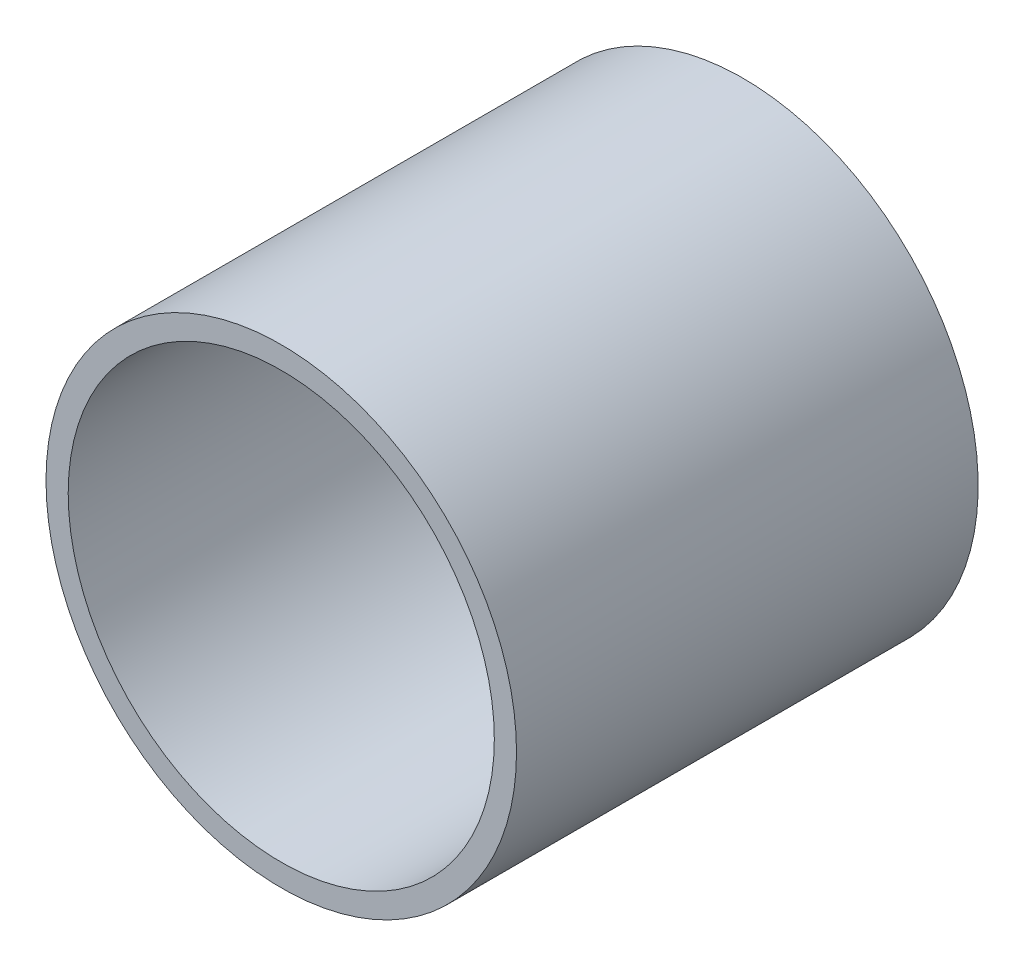
ISO-10303-21;
HEADER;
FILE_DESCRIPTION(('STEP AP214'),'2;1');
FILE_NAME('part.step','',(''),(''),'','','');
FILE_SCHEMA(('AUTOMOTIVE_DESIGN { 1 0 10303 214 1 1 1 1 }'));
ENDSEC;
DATA;
#1=APPLICATION_CONTEXT('core data for automotive mechanical design processes');
#2=APPLICATION_PROTOCOL_DEFINITION('international standard','automotive_design',2000,#1);
#3=PRODUCT_CONTEXT('',#1,'mechanical');
#4=PRODUCT('Part','Part','',(#3));
#5=PRODUCT_RELATED_PRODUCT_CATEGORY('part','',(#4));
#6=PRODUCT_DEFINITION_FORMATION('','',#4);
#7=PRODUCT_DEFINITION_CONTEXT('part definition',#1,'design');
#8=PRODUCT_DEFINITION('design','',#6,#7);
#9=PRODUCT_DEFINITION_SHAPE('','',#8);
#10=(LENGTH_UNIT() NAMED_UNIT(*) SI_UNIT(.MILLI.,.METRE.));
#11=(NAMED_UNIT(*) PLANE_ANGLE_UNIT() SI_UNIT($,.RADIAN.));
#12=(NAMED_UNIT(*) SI_UNIT($,.STERADIAN.) SOLID_ANGLE_UNIT());
#13=UNCERTAINTY_MEASURE_WITH_UNIT(LENGTH_MEASURE(1.E-05),#10,'distance_accuracy_value','');
#14=(GEOMETRIC_REPRESENTATION_CONTEXT(3) GLOBAL_UNCERTAINTY_ASSIGNED_CONTEXT((#13)) GLOBAL_UNIT_ASSIGNED_CONTEXT((#10,
#11,#12)) REPRESENTATION_CONTEXT('',''));
#15=CARTESIAN_POINT('',(0.,0.,0.));
#16=DIRECTION('',(0.,0.,1.));
#17=DIRECTION('',(1.,0.,0.));
#18=AXIS2_PLACEMENT_3D('',#15,#16,#17);
#19=CARTESIAN_POINT('',(0.,0.,50.));
#20=DIRECTION('',(0.,0.,-1.));
#21=DIRECTION('',(-1.,0.,0.));
#22=AXIS2_PLACEMENT_3D('',#19,#20,#21);
#23=CYLINDRICAL_SURFACE('',#22,24.);
#24=CARTESIAN_POINT('',(0.,0.,50.));
#25=DIRECTION('',(0.,0.,1.));
#26=DIRECTION('',(1.,0.,0.));
#27=AXIS2_PLACEMENT_3D('',#24,#25,#26);
#28=CIRCLE('',#27,24.);
#29=CARTESIAN_POINT('',(24.,0.,50.));
#30=VERTEX_POINT('',#29);
#31=EDGE_CURVE('E57',#30,#30,#28,.T.);
#32=ORIENTED_EDGE('',*,*,#31,.T.);
#33=EDGE_LOOP('',(#32));
#34=FACE_BOUND('',#33,.T.);
#35=CARTESIAN_POINT('',(0.,0.,4.8));
#36=DIRECTION('',(0.,0.,-1.));
#37=DIRECTION('',(-1.,0.,0.));
#38=AXIS2_PLACEMENT_3D('',#35,#36,#37);
#39=CIRCLE('',#38,24.);
#40=CARTESIAN_POINT('',(-24.,0.,4.8));
#41=VERTEX_POINT('',#40);
#42=EDGE_CURVE('E47',#41,#41,#39,.T.);
#43=ORIENTED_EDGE('',*,*,#42,.T.);
#44=EDGE_LOOP('',(#43));
#45=FACE_BOUND('',#44,.T.);
#46=ADVANCED_FACE('F43',(#34,#45),#23,.F.);
#47=CARTESIAN_POINT('',(0.,0.,50.));
#48=DIRECTION('',(0.,0.,1.));
#49=DIRECTION('',(1.,0.,0.));
#50=AXIS2_PLACEMENT_3D('',#47,#48,#49);
#51=PLANE('',#50);
#52=CARTESIAN_POINT('',(0.,0.,50.));
#53=DIRECTION('',(0.,0.,1.));
#54=DIRECTION('',(1.,0.,0.));
#55=AXIS2_PLACEMENT_3D('',#52,#53,#54);
#56=CIRCLE('',#55,26.5);
#57=CARTESIAN_POINT('',(26.5,0.,50.));
#58=VERTEX_POINT('',#57);
#59=EDGE_CURVE('E52',#58,#58,#56,.T.);
#60=ORIENTED_EDGE('',*,*,#59,.T.);
#61=EDGE_LOOP('',(#60));
#62=FACE_BOUND('',#61,.T.);
#63=ORIENTED_EDGE('',*,*,#31,.F.);
#64=EDGE_LOOP('',(#63));
#65=FACE_BOUND('',#64,.T.);
#66=ADVANCED_FACE('F95',(#62,#65),#51,.T.);
#67=CARTESIAN_POINT('',(0.,0.,50.));
#68=DIRECTION('',(0.,0.,-1.));
#69=DIRECTION('',(-1.,0.,0.));
#70=AXIS2_PLACEMENT_3D('',#67,#68,#69);
#71=CYLINDRICAL_SURFACE('',#70,26.5);
#72=ORIENTED_EDGE('',*,*,#59,.F.);
#73=EDGE_LOOP('',(#72));
#74=FACE_BOUND('',#73,.T.);
#75=CARTESIAN_POINT('',(0.,0.,-2.));
#76=DIRECTION('',(0.,0.,-1.));
#77=DIRECTION('',(-1.,0.,0.));
#78=AXIS2_PLACEMENT_3D('',#75,#76,#77);
#79=CIRCLE('',#78,26.5);
#80=CARTESIAN_POINT('',(-26.5,0.,-2.));
#81=VERTEX_POINT('',#80);
#82=EDGE_CURVE('E63',#81,#81,#79,.T.);
#83=ORIENTED_EDGE('',*,*,#82,.F.);
#84=EDGE_LOOP('',(#83));
#85=FACE_BOUND('',#84,.T.);
#86=ADVANCED_FACE('F45',(#74,#85),#71,.T.);
#87=CARTESIAN_POINT('',(0.,0.,-2.));
#88=DIRECTION('',(0.,0.,-1.));
#89=DIRECTION('',(-1.,0.,0.));
#90=AXIS2_PLACEMENT_3D('',#87,#88,#89);
#91=PLANE('',#90);
#92=ORIENTED_EDGE('',*,*,#82,.T.);
#93=EDGE_LOOP('',(#92));
#94=FACE_BOUND('',#93,.T.);
#95=ADVANCED_FACE('F86',(#94),#91,.T.);
#96=CARTESIAN_POINT('',(0.,-26.5,4.8));
#97=DIRECTION('',(0.,0.,-1.));
#98=DIRECTION('',(-1.,0.,0.));
#99=AXIS2_PLACEMENT_3D('',#96,#97,#98);
#100=PLANE('',#99);
#101=CARTESIAN_POINT('',(0.,0.,4.8));
#102=DIRECTION('',(0.,0.,-1.));
#103=DIRECTION('',(-1.,0.,0.));
#104=AXIS2_PLACEMENT_3D('',#101,#102,#103);
#105=CIRCLE('',#104,19.5);
#106=CARTESIAN_POINT('',(-19.5,0.,4.8));
#107=VERTEX_POINT('',#106);
#108=EDGE_CURVE('E67',#107,#107,#105,.T.);
#109=ORIENTED_EDGE('',*,*,#108,.T.);
#110=EDGE_LOOP('',(#109));
#111=FACE_BOUND('',#110,.T.);
#112=ORIENTED_EDGE('',*,*,#42,.F.);
#113=EDGE_LOOP('',(#112));
#114=FACE_BOUND('',#113,.T.);
#115=ADVANCED_FACE('F82',(#111,#114),#100,.F.);
#116=CARTESIAN_POINT('',(0.,-17.,0.));
#117=CARTESIAN_POINT('',(0.,-19.1438955774642,1.94109546667071));
#118=CARTESIAN_POINT('',(0.,-19.5,4.8));
#119=B_SPLINE_CURVE_WITH_KNOTS('',2,(#116,#117,#118),.UNSPECIFIED.,.F.,.F.,(3,3),(0.,1.),.UNSPECIFIED.);
#120=CARTESIAN_POINT('',(0.,0.,0.));
#121=DIRECTION('',(0.,0.,-1.));
#122=AXIS1_PLACEMENT('',#120,#121);
#123=SURFACE_OF_REVOLUTION('',#119,#122);
#124=ORIENTED_EDGE('',*,*,#108,.F.);
#125=EDGE_LOOP('',(#124));
#126=FACE_BOUND('',#125,.T.);
#127=CARTESIAN_POINT('',(0.,0.,0.));
#128=DIRECTION('',(0.,0.,-1.));
#129=DIRECTION('',(-1.,0.,0.));
#130=AXIS2_PLACEMENT_3D('',#127,#128,#129);
#131=CIRCLE('',#130,17.);
#132=CARTESIAN_POINT('',(-17.,0.,0.));
#133=VERTEX_POINT('',#132);
#134=EDGE_CURVE('E10',#133,#133,#131,.T.);
#135=ORIENTED_EDGE('',*,*,#134,.T.);
#136=EDGE_LOOP('',(#135));
#137=FACE_BOUND('',#136,.T.);
#138=ADVANCED_FACE('F78',(#126,#137),#123,.T.);
#139=CARTESIAN_POINT('',(0.,0.,0.));
#140=DIRECTION('',(0.,0.,-1.));
#141=DIRECTION('',(-1.,0.,0.));
#142=AXIS2_PLACEMENT_3D('',#139,#140,#141);
#143=PLANE('',#142);
#144=ORIENTED_EDGE('',*,*,#134,.F.);
#145=EDGE_LOOP('',(#144));
#146=FACE_BOUND('',#145,.T.);
#147=ADVANCED_FACE('F81',(#146),#143,.F.);
#148=CLOSED_SHELL('',(#46,#66,#86,#95,#115,#138,#147));
#149=MANIFOLD_SOLID_BREP('B2',#148);
#150=ADVANCED_BREP_SHAPE_REPRESENTATION('',(#18,#149),#14);
#151=SHAPE_DEFINITION_REPRESENTATION(#9,#150);
ENDSEC;
END-ISO-10303-21;
